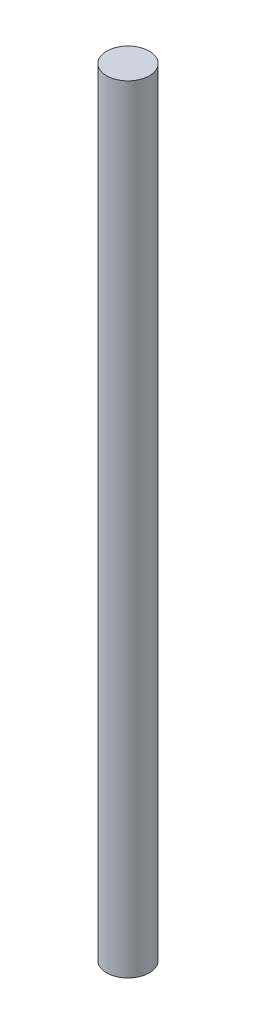
ISO-10303-21;
HEADER;
FILE_DESCRIPTION(('STEP AP214'),'2;1');
FILE_NAME('part.step','',(''),(''),'','','');
FILE_SCHEMA(('AUTOMOTIVE_DESIGN { 1 0 10303 214 1 1 1 1 }'));
ENDSEC;
DATA;
#1=APPLICATION_CONTEXT('core data for automotive mechanical design processes');
#2=APPLICATION_PROTOCOL_DEFINITION('international standard','automotive_design',2000,#1);
#3=PRODUCT_CONTEXT('',#1,'mechanical');
#4=PRODUCT('Part','Part','',(#3));
#5=PRODUCT_RELATED_PRODUCT_CATEGORY('part','',(#4));
#6=PRODUCT_DEFINITION_FORMATION('','',#4);
#7=PRODUCT_DEFINITION_CONTEXT('part definition',#1,'design');
#8=PRODUCT_DEFINITION('design','',#6,#7);
#9=PRODUCT_DEFINITION_SHAPE('','',#8);
#10=(LENGTH_UNIT() NAMED_UNIT(*) SI_UNIT(.MILLI.,.METRE.));
#11=(NAMED_UNIT(*) PLANE_ANGLE_UNIT() SI_UNIT($,.RADIAN.));
#12=(NAMED_UNIT(*) SI_UNIT($,.STERADIAN.) SOLID_ANGLE_UNIT());
#13=UNCERTAINTY_MEASURE_WITH_UNIT(LENGTH_MEASURE(1.E-05),#10,'distance_accuracy_value','');
#14=(GEOMETRIC_REPRESENTATION_CONTEXT(3) GLOBAL_UNCERTAINTY_ASSIGNED_CONTEXT((#13)) GLOBAL_UNIT_ASSIGNED_CONTEXT((#10,
#11,#12)) REPRESENTATION_CONTEXT('',''));
#15=CARTESIAN_POINT('',(0.,0.,0.));
#16=DIRECTION('',(0.,0.,1.));
#17=DIRECTION('',(1.,0.,0.));
#18=AXIS2_PLACEMENT_3D('',#15,#16,#17);
#19=CARTESIAN_POINT('',(0.,100.,0.));
#20=DIRECTION('',(0.,-1.,0.));
#21=DIRECTION('',(0.,0.,-1.));
#22=AXIS2_PLACEMENT_3D('',#19,#20,#21);
#23=CYLINDRICAL_SURFACE('',#22,2.75);
#24=CARTESIAN_POINT('',(0.,100.,0.));
#25=DIRECTION('',(0.,1.,0.));
#26=DIRECTION('',(0.,0.,1.));
#27=AXIS2_PLACEMENT_3D('',#24,#25,#26);
#28=CIRCLE('',#27,2.75);
#29=CARTESIAN_POINT('',(0.,100.,2.75));
#30=VERTEX_POINT('',#29);
#31=EDGE_CURVE('E10',#30,#30,#28,.T.);
#32=ORIENTED_EDGE('',*,*,#31,.F.);
#33=EDGE_LOOP('',(#32));
#34=FACE_BOUND('',#33,.T.);
#35=CARTESIAN_POINT('',(0.,0.,0.));
#36=DIRECTION('',(0.,1.,0.));
#37=DIRECTION('',(0.,0.,1.));
#38=AXIS2_PLACEMENT_3D('',#35,#36,#37);
#39=CIRCLE('',#38,2.75);
#40=CARTESIAN_POINT('',(0.,0.,2.75));
#41=VERTEX_POINT('',#40);
#42=EDGE_CURVE('E35',#41,#41,#39,.T.);
#43=ORIENTED_EDGE('',*,*,#42,.T.);
#44=EDGE_LOOP('',(#43));
#45=FACE_BOUND('',#44,.T.);
#46=ADVANCED_FACE('F32',(#34,#45),#23,.T.);
#47=CARTESIAN_POINT('',(0.,100.,0.));
#48=DIRECTION('',(0.,1.,0.));
#49=DIRECTION('',(0.,0.,1.));
#50=AXIS2_PLACEMENT_3D('',#47,#48,#49);
#51=PLANE('',#50);
#52=ORIENTED_EDGE('',*,*,#31,.T.);
#53=EDGE_LOOP('',(#52));
#54=FACE_BOUND('',#53,.T.);
#55=ADVANCED_FACE('F47',(#54),#51,.T.);
#56=CARTESIAN_POINT('',(0.,0.,0.));
#57=DIRECTION('',(0.,1.,0.));
#58=DIRECTION('',(0.,0.,1.));
#59=AXIS2_PLACEMENT_3D('',#56,#57,#58);
#60=PLANE('',#59);
#61=ORIENTED_EDGE('',*,*,#42,.F.);
#62=EDGE_LOOP('',(#61));
#63=FACE_BOUND('',#62,.T.);
#64=ADVANCED_FACE('F45',(#63),#60,.F.);
#65=CLOSED_SHELL('',(#46,#55,#64));
#66=MANIFOLD_SOLID_BREP('B2',#65);
#67=ADVANCED_BREP_SHAPE_REPRESENTATION('',(#18,#66),#14);
#68=SHAPE_DEFINITION_REPRESENTATION(#9,#67);
ENDSEC;
END-ISO-10303-21;
